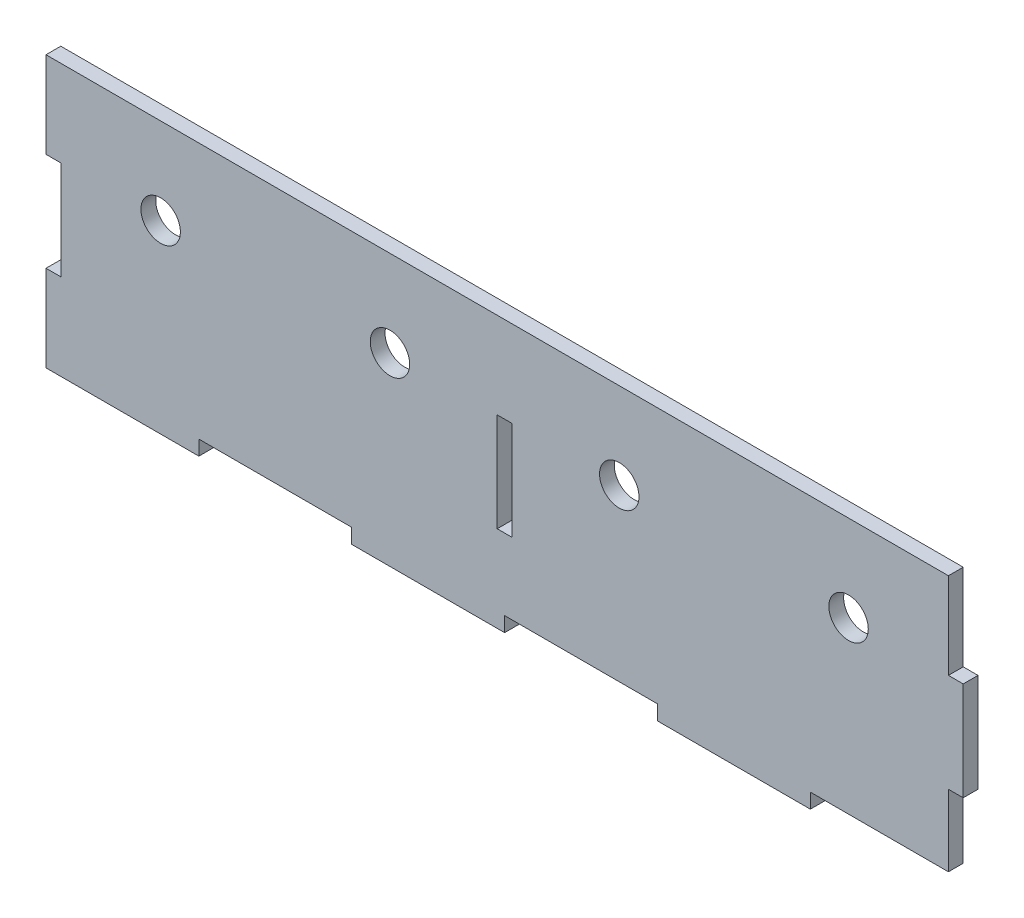
ISO-10303-21;
HEADER;
FILE_DESCRIPTION(('STEP AP214'),'2;1');
FILE_NAME('part.step','',(''),(''),'','','');
FILE_SCHEMA(('AUTOMOTIVE_DESIGN { 1 0 10303 214 1 1 1 1 }'));
ENDSEC;
DATA;
#1=APPLICATION_CONTEXT('core data for automotive mechanical design processes');
#2=APPLICATION_PROTOCOL_DEFINITION('international standard','automotive_design',2000,#1);
#3=PRODUCT_CONTEXT('',#1,'mechanical');
#4=PRODUCT('Part','Part','',(#3));
#5=PRODUCT_RELATED_PRODUCT_CATEGORY('part','',(#4));
#6=PRODUCT_DEFINITION_FORMATION('','',#4);
#7=PRODUCT_DEFINITION_CONTEXT('part definition',#1,'design');
#8=PRODUCT_DEFINITION('design','',#6,#7);
#9=PRODUCT_DEFINITION_SHAPE('','',#8);
#10=(LENGTH_UNIT() NAMED_UNIT(*) SI_UNIT(.MILLI.,.METRE.));
#11=(NAMED_UNIT(*) PLANE_ANGLE_UNIT() SI_UNIT($,.RADIAN.));
#12=(NAMED_UNIT(*) SI_UNIT($,.STERADIAN.) SOLID_ANGLE_UNIT());
#13=UNCERTAINTY_MEASURE_WITH_UNIT(LENGTH_MEASURE(1.E-05),#10,'distance_accuracy_value','');
#14=(GEOMETRIC_REPRESENTATION_CONTEXT(3) GLOBAL_UNCERTAINTY_ASSIGNED_CONTEXT((#13)) GLOBAL_UNIT_ASSIGNED_CONTEXT((#10,
#11,#12)) REPRESENTATION_CONTEXT('',''));
#15=CARTESIAN_POINT('',(0.,0.,0.));
#16=DIRECTION('',(0.,0.,1.));
#17=DIRECTION('',(1.,0.,0.));
#18=AXIS2_PLACEMENT_3D('',#15,#16,#17);
#19=CARTESIAN_POINT('',(62.,0.,3.));
#20=DIRECTION('',(-1.,0.,0.));
#21=DIRECTION('',(0.,0.,1.));
#22=AXIS2_PLACEMENT_3D('',#19,#20,#21);
#23=PLANE('',#22);
#24=DIRECTION('',(0.,1.,0.));
#25=VECTOR('',#24,1.);
#26=CARTESIAN_POINT('',(62.,0.,0.));
#27=LINE('',#26,#25);
#28=CARTESIAN_POINT('',(62.,-27.5,0.));
#29=VERTEX_POINT('',#28);
#30=CARTESIAN_POINT('',(62.,-24.4999999999999,0.));
#31=VERTEX_POINT('',#30);
#32=EDGE_CURVE('E269',#29,#31,#27,.T.);
#33=ORIENTED_EDGE('',*,*,#32,.T.);
#34=DIRECTION('',(0.,0.,-1.));
#35=VECTOR('',#34,1.);
#36=CARTESIAN_POINT('',(62.,-24.4999999999999,3.));
#37=LINE('',#36,#35);
#38=CARTESIAN_POINT('',(62.,-24.4999999999999,3.));
#39=VERTEX_POINT('',#38);
#40=EDGE_CURVE('E11',#39,#31,#37,.T.);
#41=ORIENTED_EDGE('',*,*,#40,.F.);
#42=DIRECTION('',(0.,1.,0.));
#43=VECTOR('',#42,1.);
#44=CARTESIAN_POINT('',(62.,0.,3.));
#45=LINE('',#44,#43);
#46=CARTESIAN_POINT('',(62.,-27.5,3.));
#47=VERTEX_POINT('',#46);
#48=EDGE_CURVE('E387',#47,#39,#45,.T.);
#49=ORIENTED_EDGE('',*,*,#48,.F.);
#50=DIRECTION('',(0.,0.,-1.));
#51=VECTOR('',#50,1.);
#52=CARTESIAN_POINT('',(62.,-27.5,3.));
#53=LINE('',#52,#51);
#54=EDGE_CURVE('E315',#47,#29,#53,.T.);
#55=ORIENTED_EDGE('',*,*,#54,.T.);
#56=EDGE_LOOP('',(#33,#41,#49,#55));
#57=FACE_BOUND('',#56,.T.);
#58=ADVANCED_FACE('F35',(#57),#23,.F.);
#59=CARTESIAN_POINT('',(0.,-24.4999999999999,3.));
#60=DIRECTION('',(0.,1.,0.));
#61=DIRECTION('',(0.,0.,1.));
#62=AXIS2_PLACEMENT_3D('',#59,#60,#61);
#63=PLANE('',#62);
#64=DIRECTION('',(1.,0.,0.));
#65=VECTOR('',#64,1.);
#66=CARTESIAN_POINT('',(0.,-24.4999999999999,0.));
#67=LINE('',#66,#65);
#68=CARTESIAN_POINT('',(90.,-24.4999999999999,0.));
#69=VERTEX_POINT('',#68);
#70=EDGE_CURVE('E272',#31,#69,#67,.T.);
#71=ORIENTED_EDGE('',*,*,#70,.T.);
#72=DIRECTION('',(0.,0.,-1.));
#73=VECTOR('',#72,1.);
#74=CARTESIAN_POINT('',(90.,-24.4999999999999,3.));
#75=LINE('',#74,#73);
#76=CARTESIAN_POINT('',(90.,-24.4999999999999,3.));
#77=VERTEX_POINT('',#76);
#78=EDGE_CURVE('E45',#77,#69,#75,.T.);
#79=ORIENTED_EDGE('',*,*,#78,.F.);
#80=DIRECTION('',(1.,0.,0.));
#81=VECTOR('',#80,1.);
#82=CARTESIAN_POINT('',(0.,-24.4999999999999,3.));
#83=LINE('',#82,#81);
#84=EDGE_CURVE('E395',#39,#77,#83,.T.);
#85=ORIENTED_EDGE('',*,*,#84,.F.);
#86=ORIENTED_EDGE('',*,*,#40,.T.);
#87=EDGE_LOOP('',(#71,#79,#85,#86));
#88=FACE_BOUND('',#87,.T.);
#89=ADVANCED_FACE('F471',(#88),#63,.F.);
#90=CARTESIAN_POINT('',(90.,0.,3.));
#91=DIRECTION('',(1.,0.,0.));
#92=DIRECTION('',(0.,0.,-1.));
#93=AXIS2_PLACEMENT_3D('',#90,#91,#92);
#94=PLANE('',#93);
#95=DIRECTION('',(0.,-1.,0.));
#96=VECTOR('',#95,1.);
#97=CARTESIAN_POINT('',(90.,0.,0.));
#98=LINE('',#97,#96);
#99=CARTESIAN_POINT('',(90.,-9.99999999999998,0.));
#100=VERTEX_POINT('',#99);
#101=EDGE_CURVE('E275',#100,#69,#98,.T.);
#102=ORIENTED_EDGE('',*,*,#101,.F.);
#103=DIRECTION('',(0.,0.,-1.));
#104=VECTOR('',#103,1.);
#105=CARTESIAN_POINT('',(90.,-9.99999999999998,3.));
#106=LINE('',#105,#104);
#107=CARTESIAN_POINT('',(90.,-9.99999999999998,3.));
#108=VERTEX_POINT('',#107);
#109=EDGE_CURVE('E358',#108,#100,#106,.T.);
#110=ORIENTED_EDGE('',*,*,#109,.F.);
#111=DIRECTION('',(0.,-1.,0.));
#112=VECTOR('',#111,1.);
#113=CARTESIAN_POINT('',(90.,0.,3.));
#114=LINE('',#113,#112);
#115=EDGE_CURVE('E397',#108,#77,#114,.T.);
#116=ORIENTED_EDGE('',*,*,#115,.T.);
#117=ORIENTED_EDGE('',*,*,#78,.T.);
#118=EDGE_LOOP('',(#102,#110,#116,#117));
#119=FACE_BOUND('',#118,.T.);
#120=ADVANCED_FACE('F477',(#119),#94,.T.);
#121=CARTESIAN_POINT('',(0.,-9.99999999999993,3.));
#122=DIRECTION('',(0.,-1.,0.));
#123=DIRECTION('',(1.,0.,0.));
#124=AXIS2_PLACEMENT_3D('',#121,#122,#123);
#125=PLANE('',#124);
#126=DIRECTION('',(-1.,0.,0.));
#127=VECTOR('',#126,1.);
#128=CARTESIAN_POINT('',(0.,-9.99999999999993,0.));
#129=LINE('',#128,#127);
#130=CARTESIAN_POINT('',(93.,-9.99999999999998,0.));
#131=VERTEX_POINT('',#130);
#132=EDGE_CURVE('E278',#131,#100,#129,.T.);
#133=ORIENTED_EDGE('',*,*,#132,.F.);
#134=DIRECTION('',(0.,0.,-1.));
#135=VECTOR('',#134,1.);
#136=CARTESIAN_POINT('',(93.,-9.99999999999998,3.));
#137=LINE('',#136,#135);
#138=CARTESIAN_POINT('',(93.,-9.99999999999998,3.));
#139=VERTEX_POINT('',#138);
#140=EDGE_CURVE('E356',#139,#131,#137,.T.);
#141=ORIENTED_EDGE('',*,*,#140,.F.);
#142=DIRECTION('',(-1.,0.,0.));
#143=VECTOR('',#142,1.);
#144=CARTESIAN_POINT('',(0.,-9.99999999999993,3.));
#145=LINE('',#144,#143);
#146=EDGE_CURVE('E400',#139,#108,#145,.T.);
#147=ORIENTED_EDGE('',*,*,#146,.T.);
#148=ORIENTED_EDGE('',*,*,#109,.T.);
#149=EDGE_LOOP('',(#133,#141,#147,#148));
#150=FACE_BOUND('',#149,.T.);
#151=ADVANCED_FACE('F728',(#150),#125,.T.);
#152=CARTESIAN_POINT('',(93.,0.,3.));
#153=DIRECTION('',(-1.,0.,0.));
#154=DIRECTION('',(0.,0.,1.));
#155=AXIS2_PLACEMENT_3D('',#152,#153,#154);
#156=PLANE('',#155);
#157=DIRECTION('',(0.,1.,0.));
#158=VECTOR('',#157,1.);
#159=CARTESIAN_POINT('',(93.,0.,0.));
#160=LINE('',#159,#158);
#161=CARTESIAN_POINT('',(93.,9.99999999999999,0.));
#162=VERTEX_POINT('',#161);
#163=EDGE_CURVE('E281',#131,#162,#160,.T.);
#164=ORIENTED_EDGE('',*,*,#163,.T.);
#165=DIRECTION('',(0.,0.,-1.));
#166=VECTOR('',#165,1.);
#167=CARTESIAN_POINT('',(93.,9.99999999999999,3.));
#168=LINE('',#167,#166);
#169=CARTESIAN_POINT('',(93.,9.99999999999999,3.));
#170=VERTEX_POINT('',#169);
#171=EDGE_CURVE('E353',#170,#162,#168,.T.);
#172=ORIENTED_EDGE('',*,*,#171,.F.);
#173=DIRECTION('',(0.,1.,0.));
#174=VECTOR('',#173,1.);
#175=CARTESIAN_POINT('',(93.,0.,3.));
#176=LINE('',#175,#174);
#177=EDGE_CURVE('E403',#139,#170,#176,.T.);
#178=ORIENTED_EDGE('',*,*,#177,.F.);
#179=ORIENTED_EDGE('',*,*,#140,.T.);
#180=EDGE_LOOP('',(#164,#172,#178,#179));
#181=FACE_BOUND('',#180,.T.);
#182=ADVANCED_FACE('F718',(#181),#156,.F.);
#183=CARTESIAN_POINT('',(0.,9.99999999999993,3.));
#184=DIRECTION('',(0.,-1.,0.));
#185=DIRECTION('',(1.,0.,0.));
#186=AXIS2_PLACEMENT_3D('',#183,#184,#185);
#187=PLANE('',#186);
#188=DIRECTION('',(-1.,0.,0.));
#189=VECTOR('',#188,1.);
#190=CARTESIAN_POINT('',(0.,9.99999999999993,0.));
#191=LINE('',#190,#189);
#192=CARTESIAN_POINT('',(90.,9.99999999999999,0.));
#193=VERTEX_POINT('',#192);
#194=EDGE_CURVE('E283',#162,#193,#191,.T.);
#195=ORIENTED_EDGE('',*,*,#194,.T.);
#196=DIRECTION('',(0.,0.,-1.));
#197=VECTOR('',#196,1.);
#198=CARTESIAN_POINT('',(90.,9.99999999999999,3.));
#199=LINE('',#198,#197);
#200=CARTESIAN_POINT('',(90.,9.99999999999999,3.));
#201=VERTEX_POINT('',#200);
#202=EDGE_CURVE('E350',#201,#193,#199,.T.);
#203=ORIENTED_EDGE('',*,*,#202,.F.);
#204=DIRECTION('',(-1.,0.,0.));
#205=VECTOR('',#204,1.);
#206=CARTESIAN_POINT('',(0.,9.99999999999993,3.));
#207=LINE('',#206,#205);
#208=EDGE_CURVE('E405',#170,#201,#207,.T.);
#209=ORIENTED_EDGE('',*,*,#208,.F.);
#210=ORIENTED_EDGE('',*,*,#171,.T.);
#211=EDGE_LOOP('',(#195,#203,#209,#210));
#212=FACE_BOUND('',#211,.T.);
#213=ADVANCED_FACE('F708',(#212),#187,.F.);
#214=CARTESIAN_POINT('',(90.,0.,3.));
#215=DIRECTION('',(-1.,0.,0.));
#216=DIRECTION('',(0.,0.,1.));
#217=AXIS2_PLACEMENT_3D('',#214,#215,#216);
#218=PLANE('',#217);
#219=DIRECTION('',(0.,1.,0.));
#220=VECTOR('',#219,1.);
#221=CARTESIAN_POINT('',(90.,0.,0.));
#222=LINE('',#221,#220);
#223=CARTESIAN_POINT('',(90.,27.5,0.));
#224=VERTEX_POINT('',#223);
#225=EDGE_CURVE('E285',#193,#224,#222,.T.);
#226=ORIENTED_EDGE('',*,*,#225,.T.);
#227=DIRECTION('',(0.,0.,-1.));
#228=VECTOR('',#227,1.);
#229=CARTESIAN_POINT('',(90.,27.5,3.));
#230=LINE('',#229,#228);
#231=CARTESIAN_POINT('',(90.,27.5,3.));
#232=VERTEX_POINT('',#231);
#233=EDGE_CURVE('E348',#232,#224,#230,.T.);
#234=ORIENTED_EDGE('',*,*,#233,.F.);
#235=DIRECTION('',(0.,1.,0.));
#236=VECTOR('',#235,1.);
#237=CARTESIAN_POINT('',(90.,0.,3.));
#238=LINE('',#237,#236);
#239=EDGE_CURVE('E407',#201,#232,#238,.T.);
#240=ORIENTED_EDGE('',*,*,#239,.F.);
#241=ORIENTED_EDGE('',*,*,#202,.T.);
#242=EDGE_LOOP('',(#226,#234,#240,#241));
#243=FACE_BOUND('',#242,.T.);
#244=ADVANCED_FACE('F697',(#243),#218,.F.);
#245=CARTESIAN_POINT('',(0.,27.5,3.));
#246=DIRECTION('',(0.,1.,0.));
#247=DIRECTION('',(0.,0.,1.));
#248=AXIS2_PLACEMENT_3D('',#245,#246,#247);
#249=PLANE('',#248);
#250=DIRECTION('',(1.,0.,0.));
#251=VECTOR('',#250,1.);
#252=CARTESIAN_POINT('',(0.,27.5,0.));
#253=LINE('',#252,#251);
#254=CARTESIAN_POINT('',(-93.,27.5,0.));
#255=VERTEX_POINT('',#254);
#256=EDGE_CURVE('E288',#255,#224,#253,.T.);
#257=ORIENTED_EDGE('',*,*,#256,.F.);
#258=DIRECTION('',(0.,0.,-1.));
#259=VECTOR('',#258,1.);
#260=CARTESIAN_POINT('',(-93.,27.5,3.));
#261=LINE('',#260,#259);
#262=CARTESIAN_POINT('',(-93.,27.5,3.));
#263=VERTEX_POINT('',#262);
#264=EDGE_CURVE('E346',#263,#255,#261,.T.);
#265=ORIENTED_EDGE('',*,*,#264,.F.);
#266=DIRECTION('',(1.,0.,0.));
#267=VECTOR('',#266,1.);
#268=CARTESIAN_POINT('',(0.,27.5,3.));
#269=LINE('',#268,#267);
#270=EDGE_CURVE('E409',#263,#232,#269,.T.);
#271=ORIENTED_EDGE('',*,*,#270,.T.);
#272=ORIENTED_EDGE('',*,*,#233,.T.);
#273=EDGE_LOOP('',(#257,#265,#271,#272));
#274=FACE_BOUND('',#273,.T.);
#275=ADVANCED_FACE('F687',(#274),#249,.T.);
#276=CARTESIAN_POINT('',(-93.,0.,3.));
#277=DIRECTION('',(-1.,0.,0.));
#278=DIRECTION('',(0.,0.,1.));
#279=AXIS2_PLACEMENT_3D('',#276,#277,#278);
#280=PLANE('',#279);
#281=DIRECTION('',(0.,1.,0.));
#282=VECTOR('',#281,1.);
#283=CARTESIAN_POINT('',(-93.,0.,0.));
#284=LINE('',#283,#282);
#285=CARTESIAN_POINT('',(-93.,9.99999999999999,0.));
#286=VERTEX_POINT('',#285);
#287=EDGE_CURVE('E291',#286,#255,#284,.T.);
#288=ORIENTED_EDGE('',*,*,#287,.F.);
#289=DIRECTION('',(0.,0.,-1.));
#290=VECTOR('',#289,1.);
#291=CARTESIAN_POINT('',(-93.,9.99999999999999,3.));
#292=LINE('',#291,#290);
#293=CARTESIAN_POINT('',(-93.,9.99999999999999,3.));
#294=VERTEX_POINT('',#293);
#295=EDGE_CURVE('E344',#294,#286,#292,.T.);
#296=ORIENTED_EDGE('',*,*,#295,.F.);
#297=DIRECTION('',(0.,1.,0.));
#298=VECTOR('',#297,1.);
#299=CARTESIAN_POINT('',(-93.,0.,3.));
#300=LINE('',#299,#298);
#301=EDGE_CURVE('E412',#294,#263,#300,.T.);
#302=ORIENTED_EDGE('',*,*,#301,.T.);
#303=ORIENTED_EDGE('',*,*,#264,.T.);
#304=EDGE_LOOP('',(#288,#296,#302,#303));
#305=FACE_BOUND('',#304,.T.);
#306=ADVANCED_FACE('F649',(#305),#280,.T.);
#307=CARTESIAN_POINT('',(0.,10.,3.));
#308=DIRECTION('',(0.,1.,0.));
#309=DIRECTION('',(-1.,0.,0.));
#310=AXIS2_PLACEMENT_3D('',#307,#308,#309);
#311=PLANE('',#310);
#312=DIRECTION('',(1.,0.,0.));
#313=VECTOR('',#312,1.);
#314=CARTESIAN_POINT('',(0.,10.,0.));
#315=LINE('',#314,#313);
#316=CARTESIAN_POINT('',(-90.,9.99999999999999,0.));
#317=VERTEX_POINT('',#316);
#318=EDGE_CURVE('E294',#286,#317,#315,.T.);
#319=ORIENTED_EDGE('',*,*,#318,.T.);
#320=DIRECTION('',(0.,0.,-1.));
#321=VECTOR('',#320,1.);
#322=CARTESIAN_POINT('',(-90.,9.99999999999999,3.));
#323=LINE('',#322,#321);
#324=CARTESIAN_POINT('',(-90.,9.99999999999999,3.));
#325=VERTEX_POINT('',#324);
#326=EDGE_CURVE('E341',#325,#317,#323,.T.);
#327=ORIENTED_EDGE('',*,*,#326,.F.);
#328=DIRECTION('',(1.,0.,0.));
#329=VECTOR('',#328,1.);
#330=CARTESIAN_POINT('',(0.,10.,3.));
#331=LINE('',#330,#329);
#332=EDGE_CURVE('E415',#294,#325,#331,.T.);
#333=ORIENTED_EDGE('',*,*,#332,.F.);
#334=ORIENTED_EDGE('',*,*,#295,.T.);
#335=EDGE_LOOP('',(#319,#327,#333,#334));
#336=FACE_BOUND('',#335,.T.);
#337=ADVANCED_FACE('F668',(#336),#311,.F.);
#338=CARTESIAN_POINT('',(-90.,0.,3.));
#339=DIRECTION('',(1.,0.,0.));
#340=DIRECTION('',(0.,0.,-1.));
#341=AXIS2_PLACEMENT_3D('',#338,#339,#340);
#342=PLANE('',#341);
#343=DIRECTION('',(0.,-1.,0.));
#344=VECTOR('',#343,1.);
#345=CARTESIAN_POINT('',(-90.,0.,0.));
#346=LINE('',#345,#344);
#347=CARTESIAN_POINT('',(-90.,-10.,0.));
#348=VERTEX_POINT('',#347);
#349=EDGE_CURVE('E297',#317,#348,#346,.T.);
#350=ORIENTED_EDGE('',*,*,#349,.T.);
#351=DIRECTION('',(0.,0.,-1.));
#352=VECTOR('',#351,1.);
#353=CARTESIAN_POINT('',(-90.,-10.,3.));
#354=LINE('',#353,#352);
#355=CARTESIAN_POINT('',(-90.,-10.,3.));
#356=VERTEX_POINT('',#355);
#357=EDGE_CURVE('E338',#356,#348,#354,.T.);
#358=ORIENTED_EDGE('',*,*,#357,.F.);
#359=DIRECTION('',(0.,-1.,0.));
#360=VECTOR('',#359,1.);
#361=CARTESIAN_POINT('',(-90.,0.,3.));
#362=LINE('',#361,#360);
#363=EDGE_CURVE('E418',#325,#356,#362,.T.);
#364=ORIENTED_EDGE('',*,*,#363,.F.);
#365=ORIENTED_EDGE('',*,*,#326,.T.);
#366=EDGE_LOOP('',(#350,#358,#364,#365));
#367=FACE_BOUND('',#366,.T.);
#368=ADVANCED_FACE('F658',(#367),#342,.F.);
#369=CARTESIAN_POINT('',(0.,-10.0000000000001,3.));
#370=DIRECTION('',(0.,-1.,0.));
#371=DIRECTION('',(1.,0.,0.));
#372=AXIS2_PLACEMENT_3D('',#369,#370,#371);
#373=PLANE('',#372);
#374=DIRECTION('',(-1.,0.,0.));
#375=VECTOR('',#374,1.);
#376=CARTESIAN_POINT('',(0.,-10.0000000000001,0.));
#377=LINE('',#376,#375);
#378=CARTESIAN_POINT('',(-93.,-10.,0.));
#379=VERTEX_POINT('',#378);
#380=EDGE_CURVE('E299',#348,#379,#377,.T.);
#381=ORIENTED_EDGE('',*,*,#380,.T.);
#382=DIRECTION('',(0.,0.,-1.));
#383=VECTOR('',#382,1.);
#384=CARTESIAN_POINT('',(-93.,-10.,3.));
#385=LINE('',#384,#383);
#386=CARTESIAN_POINT('',(-93.,-10.,3.));
#387=VERTEX_POINT('',#386);
#388=EDGE_CURVE('E336',#387,#379,#385,.T.);
#389=ORIENTED_EDGE('',*,*,#388,.F.);
#390=DIRECTION('',(-1.,0.,0.));
#391=VECTOR('',#390,1.);
#392=CARTESIAN_POINT('',(0.,-10.0000000000001,3.));
#393=LINE('',#392,#391);
#394=EDGE_CURVE('E420',#356,#387,#393,.T.);
#395=ORIENTED_EDGE('',*,*,#394,.F.);
#396=ORIENTED_EDGE('',*,*,#357,.T.);
#397=EDGE_LOOP('',(#381,#389,#395,#396));
#398=FACE_BOUND('',#397,.T.);
#399=ADVANCED_FACE('F646',(#398),#373,.F.);
#400=CARTESIAN_POINT('',(-93.,-27.5,0.));
#401=VERTEX_POINT('',#400);
#402=EDGE_CURVE('E295',#401,#379,#284,.T.);
#403=ORIENTED_EDGE('',*,*,#402,.F.);
#404=DIRECTION('',(0.,0.,-1.));
#405=VECTOR('',#404,1.);
#406=CARTESIAN_POINT('',(-93.,-27.5,3.));
#407=LINE('',#406,#405);
#408=CARTESIAN_POINT('',(-93.,-27.5,3.));
#409=VERTEX_POINT('',#408);
#410=EDGE_CURVE('E334',#409,#401,#407,.T.);
#411=ORIENTED_EDGE('',*,*,#410,.F.);
#412=EDGE_CURVE('E416',#409,#387,#300,.T.);
#413=ORIENTED_EDGE('',*,*,#412,.T.);
#414=ORIENTED_EDGE('',*,*,#388,.T.);
#415=EDGE_LOOP('',(#403,#411,#413,#414));
#416=FACE_BOUND('',#415,.T.);
#417=ADVANCED_FACE('F636',(#416),#280,.T.);
#418=CARTESIAN_POINT('',(0.,-27.5,3.));
#419=DIRECTION('',(0.,1.,0.));
#420=DIRECTION('',(0.,0.,1.));
#421=AXIS2_PLACEMENT_3D('',#418,#419,#420);
#422=PLANE('',#421);
#423=DIRECTION('',(1.,0.,0.));
#424=VECTOR('',#423,1.);
#425=CARTESIAN_POINT('',(0.,-27.5,0.));
#426=LINE('',#425,#424);
#427=CARTESIAN_POINT('',(-62.,-27.5,0.));
#428=VERTEX_POINT('',#427);
#429=EDGE_CURVE('E302',#401,#428,#426,.T.);
#430=ORIENTED_EDGE('',*,*,#429,.T.);
#431=DIRECTION('',(0.,0.,-1.));
#432=VECTOR('',#431,1.);
#433=CARTESIAN_POINT('',(-62.,-27.5,3.));
#434=LINE('',#433,#432);
#435=CARTESIAN_POINT('',(-62.,-27.5,3.));
#436=VERTEX_POINT('',#435);
#437=EDGE_CURVE('E331',#436,#428,#434,.T.);
#438=ORIENTED_EDGE('',*,*,#437,.F.);
#439=DIRECTION('',(1.,0.,0.));
#440=VECTOR('',#439,1.);
#441=CARTESIAN_POINT('',(0.,-27.5,3.));
#442=LINE('',#441,#440);
#443=EDGE_CURVE('E242',#409,#436,#442,.T.);
#444=ORIENTED_EDGE('',*,*,#443,.F.);
#445=ORIENTED_EDGE('',*,*,#410,.T.);
#446=EDGE_LOOP('',(#430,#438,#444,#445));
#447=FACE_BOUND('',#446,.T.);
#448=ADVANCED_FACE('F468',(#447),#422,.F.);
#449=CARTESIAN_POINT('',(-62.,0.,3.));
#450=DIRECTION('',(-1.,0.,0.));
#451=DIRECTION('',(0.,0.,1.));
#452=AXIS2_PLACEMENT_3D('',#449,#450,#451);
#453=PLANE('',#452);
#454=DIRECTION('',(0.,1.,0.));
#455=VECTOR('',#454,1.);
#456=CARTESIAN_POINT('',(-62.,0.,0.));
#457=LINE('',#456,#455);
#458=CARTESIAN_POINT('',(-62.,-24.5,0.));
#459=VERTEX_POINT('',#458);
#460=EDGE_CURVE('E304',#428,#459,#457,.T.);
#461=ORIENTED_EDGE('',*,*,#460,.T.);
#462=DIRECTION('',(0.,0.,-1.));
#463=VECTOR('',#462,1.);
#464=CARTESIAN_POINT('',(-62.,-24.5,3.));
#465=LINE('',#464,#463);
#466=CARTESIAN_POINT('',(-62.,-24.5,3.));
#467=VERTEX_POINT('',#466);
#468=EDGE_CURVE('E328',#467,#459,#465,.T.);
#469=ORIENTED_EDGE('',*,*,#468,.F.);
#470=DIRECTION('',(0.,1.,0.));
#471=VECTOR('',#470,1.);
#472=CARTESIAN_POINT('',(-62.,0.,3.));
#473=LINE('',#472,#471);
#474=EDGE_CURVE('E422',#436,#467,#473,.T.);
#475=ORIENTED_EDGE('',*,*,#474,.F.);
#476=ORIENTED_EDGE('',*,*,#437,.T.);
#477=EDGE_LOOP('',(#461,#469,#475,#476));
#478=FACE_BOUND('',#477,.T.);
#479=ADVANCED_FACE('F617',(#478),#453,.F.);
#480=CARTESIAN_POINT('',(0.,-24.5,3.));
#481=DIRECTION('',(0.,1.,0.));
#482=DIRECTION('',(0.,0.,1.));
#483=AXIS2_PLACEMENT_3D('',#480,#481,#482);
#484=PLANE('',#483);
#485=DIRECTION('',(1.,0.,0.));
#486=VECTOR('',#485,1.);
#487=CARTESIAN_POINT('',(0.,-24.5,0.));
#488=LINE('',#487,#486);
#489=CARTESIAN_POINT('',(-31.,-24.5,0.));
#490=VERTEX_POINT('',#489);
#491=EDGE_CURVE('E307',#459,#490,#488,.T.);
#492=ORIENTED_EDGE('',*,*,#491,.T.);
#493=DIRECTION('',(0.,0.,-1.));
#494=VECTOR('',#493,1.);
#495=CARTESIAN_POINT('',(-31.,-24.5,3.));
#496=LINE('',#495,#494);
#497=CARTESIAN_POINT('',(-31.,-24.5,3.));
#498=VERTEX_POINT('',#497);
#499=EDGE_CURVE('E325',#498,#490,#496,.T.);
#500=ORIENTED_EDGE('',*,*,#499,.F.);
#501=DIRECTION('',(1.,0.,0.));
#502=VECTOR('',#501,1.);
#503=CARTESIAN_POINT('',(0.,-24.5,3.));
#504=LINE('',#503,#502);
#505=EDGE_CURVE('E424',#467,#498,#504,.T.);
#506=ORIENTED_EDGE('',*,*,#505,.F.);
#507=ORIENTED_EDGE('',*,*,#468,.T.);
#508=EDGE_LOOP('',(#492,#500,#506,#507));
#509=FACE_BOUND('',#508,.T.);
#510=ADVANCED_FACE('F607',(#509),#484,.F.);
#511=CARTESIAN_POINT('',(-31.,0.,3.));
#512=DIRECTION('',(1.,0.,0.));
#513=DIRECTION('',(0.,0.,-1.));
#514=AXIS2_PLACEMENT_3D('',#511,#512,#513);
#515=PLANE('',#514);
#516=DIRECTION('',(0.,-1.,0.));
#517=VECTOR('',#516,1.);
#518=CARTESIAN_POINT('',(-31.,0.,0.));
#519=LINE('',#518,#517);
#520=CARTESIAN_POINT('',(-31.,-27.5,0.));
#521=VERTEX_POINT('',#520);
#522=EDGE_CURVE('E309',#490,#521,#519,.T.);
#523=ORIENTED_EDGE('',*,*,#522,.T.);
#524=DIRECTION('',(0.,0.,-1.));
#525=VECTOR('',#524,1.);
#526=CARTESIAN_POINT('',(-31.,-27.5,3.));
#527=LINE('',#526,#525);
#528=CARTESIAN_POINT('',(-31.,-27.5,3.));
#529=VERTEX_POINT('',#528);
#530=EDGE_CURVE('E322',#529,#521,#527,.T.);
#531=ORIENTED_EDGE('',*,*,#530,.F.);
#532=DIRECTION('',(0.,-1.,0.));
#533=VECTOR('',#532,1.);
#534=CARTESIAN_POINT('',(-31.,0.,3.));
#535=LINE('',#534,#533);
#536=EDGE_CURVE('E426',#498,#529,#535,.T.);
#537=ORIENTED_EDGE('',*,*,#536,.F.);
#538=ORIENTED_EDGE('',*,*,#499,.T.);
#539=EDGE_LOOP('',(#523,#531,#537,#538));
#540=FACE_BOUND('',#539,.T.);
#541=ADVANCED_FACE('F597',(#540),#515,.F.);
#542=CARTESIAN_POINT('',(0.,-27.5,0.));
#543=VERTEX_POINT('',#542);
#544=EDGE_CURVE('E305',#521,#543,#426,.T.);
#545=ORIENTED_EDGE('',*,*,#544,.T.);
#546=DIRECTION('',(0.,0.,-1.));
#547=VECTOR('',#546,1.);
#548=CARTESIAN_POINT('',(0.,-27.5,3.));
#549=LINE('',#548,#547);
#550=CARTESIAN_POINT('',(0.,-27.5,3.));
#551=VERTEX_POINT('',#550);
#552=EDGE_CURVE('E319',#551,#543,#549,.T.);
#553=ORIENTED_EDGE('',*,*,#552,.F.);
#554=EDGE_CURVE('E241',#529,#551,#442,.T.);
#555=ORIENTED_EDGE('',*,*,#554,.F.);
#556=ORIENTED_EDGE('',*,*,#530,.T.);
#557=EDGE_LOOP('',(#545,#553,#555,#556));
#558=FACE_BOUND('',#557,.T.);
#559=ADVANCED_FACE('F432',(#558),#422,.F.);
#560=CARTESIAN_POINT('',(0.,0.,3.));
#561=DIRECTION('',(-1.,0.,0.));
#562=DIRECTION('',(0.,0.,1.));
#563=AXIS2_PLACEMENT_3D('',#560,#561,#562);
#564=PLANE('',#563);
#565=DIRECTION('',(0.,1.,0.));
#566=VECTOR('',#565,1.);
#567=CARTESIAN_POINT('',(0.,0.,0.));
#568=LINE('',#567,#566);
#569=CARTESIAN_POINT('',(0.,-24.5,0.));
#570=VERTEX_POINT('',#569);
#571=EDGE_CURVE('E311',#543,#570,#568,.T.);
#572=ORIENTED_EDGE('',*,*,#571,.T.);
#573=DIRECTION('',(0.,0.,-1.));
#574=VECTOR('',#573,1.);
#575=CARTESIAN_POINT('',(0.,-24.5,3.));
#576=LINE('',#575,#574);
#577=CARTESIAN_POINT('',(0.,-24.5,3.));
#578=VERTEX_POINT('',#577);
#579=EDGE_CURVE('E234',#578,#570,#576,.T.);
#580=ORIENTED_EDGE('',*,*,#579,.F.);
#581=DIRECTION('',(0.,1.,0.));
#582=VECTOR('',#581,1.);
#583=CARTESIAN_POINT('',(0.,0.,3.));
#584=LINE('',#583,#582);
#585=EDGE_CURVE('E225',#551,#578,#584,.T.);
#586=ORIENTED_EDGE('',*,*,#585,.F.);
#587=ORIENTED_EDGE('',*,*,#552,.T.);
#588=EDGE_LOOP('',(#572,#580,#586,#587));
#589=FACE_BOUND('',#588,.T.);
#590=ADVANCED_FACE('F436',(#589),#564,.F.);
#591=CARTESIAN_POINT('',(0.,-24.5,3.));
#592=DIRECTION('',(0.,1.,0.));
#593=DIRECTION('',(0.,0.,1.));
#594=AXIS2_PLACEMENT_3D('',#591,#592,#593);
#595=PLANE('',#594);
#596=DIRECTION('',(1.,0.,0.));
#597=VECTOR('',#596,1.);
#598=CARTESIAN_POINT('',(0.,-24.5,0.));
#599=LINE('',#598,#597);
#600=CARTESIAN_POINT('',(31.,-24.5,0.));
#601=VERTEX_POINT('',#600);
#602=EDGE_CURVE('E233',#570,#601,#599,.T.);
#603=ORIENTED_EDGE('',*,*,#602,.T.);
#604=DIRECTION('',(0.,0.,-1.));
#605=VECTOR('',#604,1.);
#606=CARTESIAN_POINT('',(31.,-24.5,3.));
#607=LINE('',#606,#605);
#608=CARTESIAN_POINT('',(31.,-24.5,3.));
#609=VERTEX_POINT('',#608);
#610=EDGE_CURVE('E230',#609,#601,#607,.T.);
#611=ORIENTED_EDGE('',*,*,#610,.F.);
#612=DIRECTION('',(1.,0.,0.));
#613=VECTOR('',#612,1.);
#614=CARTESIAN_POINT('',(0.,-24.5,3.));
#615=LINE('',#614,#613);
#616=EDGE_CURVE('E219',#578,#609,#615,.T.);
#617=ORIENTED_EDGE('',*,*,#616,.F.);
#618=ORIENTED_EDGE('',*,*,#579,.T.);
#619=EDGE_LOOP('',(#603,#611,#617,#618));
#620=FACE_BOUND('',#619,.T.);
#621=ADVANCED_FACE('F231',(#620),#595,.F.);
#622=CARTESIAN_POINT('',(31.,0.,3.));
#623=DIRECTION('',(1.,0.,0.));
#624=DIRECTION('',(0.,0.,-1.));
#625=AXIS2_PLACEMENT_3D('',#622,#623,#624);
#626=PLANE('',#625);
#627=DIRECTION('',(0.,-1.,0.));
#628=VECTOR('',#627,1.);
#629=CARTESIAN_POINT('',(31.,0.,0.));
#630=LINE('',#629,#628);
#631=CARTESIAN_POINT('',(31.,-27.5,0.));
#632=VERTEX_POINT('',#631);
#633=EDGE_CURVE('E137',#601,#632,#630,.T.);
#634=ORIENTED_EDGE('',*,*,#633,.T.);
#635=DIRECTION('',(0.,0.,-1.));
#636=VECTOR('',#635,1.);
#637=CARTESIAN_POINT('',(31.,-27.5,3.));
#638=LINE('',#637,#636);
#639=CARTESIAN_POINT('',(31.,-27.5,3.));
#640=VERTEX_POINT('',#639);
#641=EDGE_CURVE('E235',#640,#632,#638,.T.);
#642=ORIENTED_EDGE('',*,*,#641,.F.);
#643=DIRECTION('',(0.,-1.,0.));
#644=VECTOR('',#643,1.);
#645=CARTESIAN_POINT('',(31.,0.,3.));
#646=LINE('',#645,#644);
#647=EDGE_CURVE('E223',#609,#640,#646,.T.);
#648=ORIENTED_EDGE('',*,*,#647,.F.);
#649=ORIENTED_EDGE('',*,*,#610,.T.);
#650=EDGE_LOOP('',(#634,#642,#648,#649));
#651=FACE_BOUND('',#650,.T.);
#652=ADVANCED_FACE('F237',(#651),#626,.F.);
#653=CARTESIAN_POINT('',(1.50000000000003,0.,3.));
#654=DIRECTION('',(-1.,0.,0.));
#655=DIRECTION('',(0.,0.,1.));
#656=AXIS2_PLACEMENT_3D('',#653,#654,#655);
#657=PLANE('',#656);
#658=DIRECTION('',(0.,1.,0.));
#659=VECTOR('',#658,1.);
#660=CARTESIAN_POINT('',(1.50000000000003,0.,0.));
#661=LINE('',#660,#659);
#662=CARTESIAN_POINT('',(1.50000000000003,-10.,0.));
#663=VERTEX_POINT('',#662);
#664=CARTESIAN_POINT('',(1.50000000000003,10.,0.));
#665=VERTEX_POINT('',#664);
#666=EDGE_CURVE('E257',#663,#665,#661,.T.);
#667=ORIENTED_EDGE('',*,*,#666,.F.);
#668=DIRECTION('',(0.,0.,-1.));
#669=VECTOR('',#668,1.);
#670=CARTESIAN_POINT('',(1.50000000000003,-10.,3.));
#671=LINE('',#670,#669);
#672=CARTESIAN_POINT('',(1.50000000000003,-10.,3.));
#673=VERTEX_POINT('',#672);
#674=EDGE_CURVE('E39',#673,#663,#671,.T.);
#675=ORIENTED_EDGE('',*,*,#674,.F.);
#676=DIRECTION('',(0.,1.,0.));
#677=VECTOR('',#676,1.);
#678=CARTESIAN_POINT('',(1.50000000000003,0.,3.));
#679=LINE('',#678,#677);
#680=CARTESIAN_POINT('',(1.50000000000003,10.,3.));
#681=VERTEX_POINT('',#680);
#682=EDGE_CURVE('E390',#673,#681,#679,.T.);
#683=ORIENTED_EDGE('',*,*,#682,.T.);
#684=DIRECTION('',(0.,0.,-1.));
#685=VECTOR('',#684,1.);
#686=CARTESIAN_POINT('',(1.50000000000003,10.,3.));
#687=LINE('',#686,#685);
#688=EDGE_CURVE('E239',#681,#665,#687,.T.);
#689=ORIENTED_EDGE('',*,*,#688,.T.);
#690=EDGE_LOOP('',(#667,#675,#683,#689));
#691=FACE_BOUND('',#690,.T.);
#692=ADVANCED_FACE('F374',(#691),#657,.T.);
#693=CARTESIAN_POINT('',(0.,-10.,3.));
#694=DIRECTION('',(0.,1.,0.));
#695=DIRECTION('',(0.,0.,1.));
#696=AXIS2_PLACEMENT_3D('',#693,#694,#695);
#697=PLANE('',#696);
#698=DIRECTION('',(1.,0.,0.));
#699=VECTOR('',#698,1.);
#700=CARTESIAN_POINT('',(0.,-10.,0.));
#701=LINE('',#700,#699);
#702=CARTESIAN_POINT('',(-1.49999999999997,-10.,0.));
#703=VERTEX_POINT('',#702);
#704=EDGE_CURVE('E260',#703,#663,#701,.T.);
#705=ORIENTED_EDGE('',*,*,#704,.F.);
#706=DIRECTION('',(0.,0.,-1.));
#707=VECTOR('',#706,1.);
#708=CARTESIAN_POINT('',(-1.49999999999997,-10.,3.));
#709=LINE('',#708,#707);
#710=CARTESIAN_POINT('',(-1.49999999999997,-10.,3.));
#711=VERTEX_POINT('',#710);
#712=EDGE_CURVE('E364',#711,#703,#709,.T.);
#713=ORIENTED_EDGE('',*,*,#712,.F.);
#714=DIRECTION('',(1.,0.,0.));
#715=VECTOR('',#714,1.);
#716=CARTESIAN_POINT('',(0.,-10.,3.));
#717=LINE('',#716,#715);
#718=EDGE_CURVE('E373',#711,#673,#717,.T.);
#719=ORIENTED_EDGE('',*,*,#718,.T.);
#720=ORIENTED_EDGE('',*,*,#674,.T.);
#721=EDGE_LOOP('',(#705,#713,#719,#720));
#722=FACE_BOUND('',#721,.T.);
#723=ADVANCED_FACE('F371',(#722),#697,.T.);
#724=CARTESIAN_POINT('',(-1.49999999999997,0.,3.));
#725=DIRECTION('',(-1.,0.,0.));
#726=DIRECTION('',(0.,0.,1.));
#727=AXIS2_PLACEMENT_3D('',#724,#725,#726);
#728=PLANE('',#727);
#729=DIRECTION('',(0.,1.,0.));
#730=VECTOR('',#729,1.);
#731=CARTESIAN_POINT('',(-1.49999999999997,0.,0.));
#732=LINE('',#731,#730);
#733=CARTESIAN_POINT('',(-1.49999999999997,10.,0.));
#734=VERTEX_POINT('',#733);
#735=EDGE_CURVE('E263',#703,#734,#732,.T.);
#736=ORIENTED_EDGE('',*,*,#735,.T.);
#737=DIRECTION('',(0.,0.,-1.));
#738=VECTOR('',#737,1.);
#739=CARTESIAN_POINT('',(-1.49999999999997,10.,3.));
#740=LINE('',#739,#738);
#741=CARTESIAN_POINT('',(-1.49999999999997,10.,3.));
#742=VERTEX_POINT('',#741);
#743=EDGE_CURVE('E362',#742,#734,#740,.T.);
#744=ORIENTED_EDGE('',*,*,#743,.F.);
#745=DIRECTION('',(0.,1.,0.));
#746=VECTOR('',#745,1.);
#747=CARTESIAN_POINT('',(-1.49999999999997,0.,3.));
#748=LINE('',#747,#746);
#749=EDGE_CURVE('E382',#711,#742,#748,.T.);
#750=ORIENTED_EDGE('',*,*,#749,.F.);
#751=ORIENTED_EDGE('',*,*,#712,.T.);
#752=EDGE_LOOP('',(#736,#744,#750,#751));
#753=FACE_BOUND('',#752,.T.);
#754=ADVANCED_FACE('F380',(#753),#728,.F.);
#755=CARTESIAN_POINT('',(0.,10.,3.));
#756=DIRECTION('',(0.,1.,0.));
#757=DIRECTION('',(0.,0.,1.));
#758=AXIS2_PLACEMENT_3D('',#755,#756,#757);
#759=PLANE('',#758);
#760=DIRECTION('',(1.,0.,0.));
#761=VECTOR('',#760,1.);
#762=CARTESIAN_POINT('',(0.,10.,0.));
#763=LINE('',#762,#761);
#764=EDGE_CURVE('E266',#734,#665,#763,.T.);
#765=ORIENTED_EDGE('',*,*,#764,.T.);
#766=ORIENTED_EDGE('',*,*,#688,.F.);
#767=DIRECTION('',(1.,0.,0.));
#768=VECTOR('',#767,1.);
#769=CARTESIAN_POINT('',(0.,10.,3.));
#770=LINE('',#769,#768);
#771=EDGE_CURVE('E385',#742,#681,#770,.T.);
#772=ORIENTED_EDGE('',*,*,#771,.F.);
#773=ORIENTED_EDGE('',*,*,#743,.T.);
#774=EDGE_LOOP('',(#765,#766,#772,#773));
#775=FACE_BOUND('',#774,.T.);
#776=ADVANCED_FACE('F384',(#775),#759,.F.);
#777=CARTESIAN_POINT('',(-69.75,9.99999999999999,3.));
#778=DIRECTION('',(0.,0.,-1.));
#779=DIRECTION('',(-1.,0.,0.));
#780=AXIS2_PLACEMENT_3D('',#777,#778,#779);
#781=CYLINDRICAL_SURFACE('',#780,4.00000000000001);
#782=CARTESIAN_POINT('',(-69.75,9.99999999999999,3.));
#783=DIRECTION('',(0.,0.,1.));
#784=DIRECTION('',(1.,0.,0.));
#785=AXIS2_PLACEMENT_3D('',#782,#783,#784);
#786=CIRCLE('',#785,4.00000000000001);
#787=CARTESIAN_POINT('',(-65.7499999999999,9.99999999999999,3.));
#788=VERTEX_POINT('',#787);
#789=EDGE_CURVE('E450',#788,#788,#786,.T.);
#790=ORIENTED_EDGE('',*,*,#789,.T.);
#791=EDGE_LOOP('',(#790));
#792=FACE_BOUND('',#791,.T.);
#793=CARTESIAN_POINT('',(-69.75,9.99999999999999,0.));
#794=DIRECTION('',(0.,0.,1.));
#795=DIRECTION('',(1.,0.,0.));
#796=AXIS2_PLACEMENT_3D('',#793,#794,#795);
#797=CIRCLE('',#796,4.00000000000001);
#798=CARTESIAN_POINT('',(-65.7499999999999,9.99999999999999,0.));
#799=VERTEX_POINT('',#798);
#800=EDGE_CURVE('E254',#799,#799,#797,.T.);
#801=ORIENTED_EDGE('',*,*,#800,.F.);
#802=EDGE_LOOP('',(#801));
#803=FACE_BOUND('',#802,.T.);
#804=ADVANCED_FACE('F454',(#792,#803),#781,.F.);
#805=CARTESIAN_POINT('',(-23.25,9.99999999999999,3.));
#806=DIRECTION('',(0.,0.,-1.));
#807=DIRECTION('',(-1.,0.,0.));
#808=AXIS2_PLACEMENT_3D('',#805,#806,#807);
#809=CYLINDRICAL_SURFACE('',#808,4.);
#810=CARTESIAN_POINT('',(-23.25,9.99999999999999,3.));
#811=DIRECTION('',(0.,0.,1.));
#812=DIRECTION('',(1.,0.,0.));
#813=AXIS2_PLACEMENT_3D('',#810,#811,#812);
#814=CIRCLE('',#813,4.);
#815=CARTESIAN_POINT('',(-19.25,9.99999999999999,3.));
#816=VERTEX_POINT('',#815);
#817=EDGE_CURVE('E445',#816,#816,#814,.T.);
#818=ORIENTED_EDGE('',*,*,#817,.T.);
#819=EDGE_LOOP('',(#818));
#820=FACE_BOUND('',#819,.T.);
#821=CARTESIAN_POINT('',(-23.25,9.99999999999999,0.));
#822=DIRECTION('',(0.,0.,1.));
#823=DIRECTION('',(1.,0.,0.));
#824=AXIS2_PLACEMENT_3D('',#821,#822,#823);
#825=CIRCLE('',#824,4.);
#826=CARTESIAN_POINT('',(-19.25,9.99999999999999,0.));
#827=VERTEX_POINT('',#826);
#828=EDGE_CURVE('E251',#827,#827,#825,.T.);
#829=ORIENTED_EDGE('',*,*,#828,.F.);
#830=EDGE_LOOP('',(#829));
#831=FACE_BOUND('',#830,.T.);
#832=ADVANCED_FACE('F492',(#820,#831),#809,.F.);
#833=CARTESIAN_POINT('',(23.25,9.99999999999999,3.));
#834=DIRECTION('',(0.,0.,-1.));
#835=DIRECTION('',(-1.,0.,0.));
#836=AXIS2_PLACEMENT_3D('',#833,#834,#835);
#837=CYLINDRICAL_SURFACE('',#836,4.);
#838=CARTESIAN_POINT('',(23.25,9.99999999999999,3.));
#839=DIRECTION('',(0.,0.,1.));
#840=DIRECTION('',(1.,0.,0.));
#841=AXIS2_PLACEMENT_3D('',#838,#839,#840);
#842=CIRCLE('',#841,4.);
#843=CARTESIAN_POINT('',(27.25,9.99999999999999,3.));
#844=VERTEX_POINT('',#843);
#845=EDGE_CURVE('E440',#844,#844,#842,.T.);
#846=ORIENTED_EDGE('',*,*,#845,.T.);
#847=EDGE_LOOP('',(#846));
#848=FACE_BOUND('',#847,.T.);
#849=CARTESIAN_POINT('',(23.25,9.99999999999999,0.));
#850=DIRECTION('',(0.,0.,1.));
#851=DIRECTION('',(1.,0.,0.));
#852=AXIS2_PLACEMENT_3D('',#849,#850,#851);
#853=CIRCLE('',#852,4.);
#854=CARTESIAN_POINT('',(27.25,9.99999999999999,0.));
#855=VERTEX_POINT('',#854);
#856=EDGE_CURVE('E248',#855,#855,#853,.T.);
#857=ORIENTED_EDGE('',*,*,#856,.F.);
#858=EDGE_LOOP('',(#857));
#859=FACE_BOUND('',#858,.T.);
#860=ADVANCED_FACE('F494',(#848,#859),#837,.F.);
#861=CARTESIAN_POINT('',(69.75,9.99999999999999,3.));
#862=DIRECTION('',(0.,0.,-1.));
#863=DIRECTION('',(-1.,0.,0.));
#864=AXIS2_PLACEMENT_3D('',#861,#862,#863);
#865=CYLINDRICAL_SURFACE('',#864,4.00000000000001);
#866=CARTESIAN_POINT('',(69.75,9.99999999999999,3.));
#867=DIRECTION('',(0.,0.,1.));
#868=DIRECTION('',(1.,0.,0.));
#869=AXIS2_PLACEMENT_3D('',#866,#867,#868);
#870=CIRCLE('',#869,4.00000000000001);
#871=CARTESIAN_POINT('',(73.7500000000001,9.99999999999999,3.));
#872=VERTEX_POINT('',#871);
#873=EDGE_CURVE('E438',#872,#872,#870,.T.);
#874=ORIENTED_EDGE('',*,*,#873,.T.);
#875=EDGE_LOOP('',(#874));
#876=FACE_BOUND('',#875,.T.);
#877=CARTESIAN_POINT('',(69.75,9.99999999999999,0.));
#878=DIRECTION('',(0.,0.,1.));
#879=DIRECTION('',(1.,0.,0.));
#880=AXIS2_PLACEMENT_3D('',#877,#878,#879);
#881=CIRCLE('',#880,4.00000000000001);
#882=CARTESIAN_POINT('',(73.7500000000001,9.99999999999999,0.));
#883=VERTEX_POINT('',#882);
#884=EDGE_CURVE('E245',#883,#883,#881,.T.);
#885=ORIENTED_EDGE('',*,*,#884,.F.);
#886=EDGE_LOOP('',(#885));
#887=FACE_BOUND('',#886,.T.);
#888=ADVANCED_FACE('F37',(#876,#887),#865,.F.);
#889=EDGE_CURVE('E143',#632,#29,#426,.T.);
#890=ORIENTED_EDGE('',*,*,#889,.T.);
#891=ORIENTED_EDGE('',*,*,#54,.F.);
#892=EDGE_CURVE('E54',#640,#47,#442,.T.);
#893=ORIENTED_EDGE('',*,*,#892,.F.);
#894=ORIENTED_EDGE('',*,*,#641,.T.);
#895=EDGE_LOOP('',(#890,#891,#893,#894));
#896=FACE_BOUND('',#895,.T.);
#897=ADVANCED_FACE('F458',(#896),#422,.F.);
#898=CARTESIAN_POINT('',(0.,0.,3.));
#899=DIRECTION('',(0.,0.,1.));
#900=DIRECTION('',(1.,0.,0.));
#901=AXIS2_PLACEMENT_3D('',#898,#899,#900);
#902=PLANE('',#901);
#903=ORIENTED_EDGE('',*,*,#873,.F.);
#904=EDGE_LOOP('',(#903));
#905=FACE_BOUND('',#904,.T.);
#906=ORIENTED_EDGE('',*,*,#845,.F.);
#907=EDGE_LOOP('',(#906));
#908=FACE_BOUND('',#907,.T.);
#909=ORIENTED_EDGE('',*,*,#817,.F.);
#910=EDGE_LOOP('',(#909));
#911=FACE_BOUND('',#910,.T.);
#912=ORIENTED_EDGE('',*,*,#789,.F.);
#913=EDGE_LOOP('',(#912));
#914=FACE_BOUND('',#913,.T.);
#915=ORIENTED_EDGE('',*,*,#682,.F.);
#916=ORIENTED_EDGE('',*,*,#718,.F.);
#917=ORIENTED_EDGE('',*,*,#749,.T.);
#918=ORIENTED_EDGE('',*,*,#771,.T.);
#919=EDGE_LOOP('',(#915,#916,#917,#918));
#920=FACE_BOUND('',#919,.T.);
#921=ORIENTED_EDGE('',*,*,#48,.T.);
#922=ORIENTED_EDGE('',*,*,#84,.T.);
#923=ORIENTED_EDGE('',*,*,#115,.F.);
#924=ORIENTED_EDGE('',*,*,#146,.F.);
#925=ORIENTED_EDGE('',*,*,#177,.T.);
#926=ORIENTED_EDGE('',*,*,#208,.T.);
#927=ORIENTED_EDGE('',*,*,#239,.T.);
#928=ORIENTED_EDGE('',*,*,#270,.F.);
#929=ORIENTED_EDGE('',*,*,#301,.F.);
#930=ORIENTED_EDGE('',*,*,#332,.T.);
#931=ORIENTED_EDGE('',*,*,#363,.T.);
#932=ORIENTED_EDGE('',*,*,#394,.T.);
#933=ORIENTED_EDGE('',*,*,#412,.F.);
#934=ORIENTED_EDGE('',*,*,#443,.T.);
#935=ORIENTED_EDGE('',*,*,#474,.T.);
#936=ORIENTED_EDGE('',*,*,#505,.T.);
#937=ORIENTED_EDGE('',*,*,#536,.T.);
#938=ORIENTED_EDGE('',*,*,#554,.T.);
#939=ORIENTED_EDGE('',*,*,#585,.T.);
#940=ORIENTED_EDGE('',*,*,#616,.T.);
#941=ORIENTED_EDGE('',*,*,#647,.T.);
#942=ORIENTED_EDGE('',*,*,#892,.T.);
#943=EDGE_LOOP('',(#921,#922,#923,#924,#925,#926,#927,#928,#929,#930,#931,#932,#933,#934,#935,
#936,#937,#938,#939,#940,#941,#942));
#944=FACE_BOUND('',#943,.T.);
#945=ADVANCED_FACE('F221',(#905,#908,#911,#914,#920,#944),#902,.T.);
#946=CARTESIAN_POINT('',(0.,0.,0.));
#947=DIRECTION('',(0.,0.,1.));
#948=DIRECTION('',(1.,0.,0.));
#949=AXIS2_PLACEMENT_3D('',#946,#947,#948);
#950=PLANE('',#949);
#951=ORIENTED_EDGE('',*,*,#884,.T.);
#952=EDGE_LOOP('',(#951));
#953=FACE_BOUND('',#952,.T.);
#954=ORIENTED_EDGE('',*,*,#856,.T.);
#955=EDGE_LOOP('',(#954));
#956=FACE_BOUND('',#955,.T.);
#957=ORIENTED_EDGE('',*,*,#828,.T.);
#958=EDGE_LOOP('',(#957));
#959=FACE_BOUND('',#958,.T.);
#960=ORIENTED_EDGE('',*,*,#800,.T.);
#961=EDGE_LOOP('',(#960));
#962=FACE_BOUND('',#961,.T.);
#963=ORIENTED_EDGE('',*,*,#666,.T.);
#964=ORIENTED_EDGE('',*,*,#764,.F.);
#965=ORIENTED_EDGE('',*,*,#735,.F.);
#966=ORIENTED_EDGE('',*,*,#704,.T.);
#967=EDGE_LOOP('',(#963,#964,#965,#966));
#968=FACE_BOUND('',#967,.T.);
#969=ORIENTED_EDGE('',*,*,#32,.F.);
#970=ORIENTED_EDGE('',*,*,#889,.F.);
#971=ORIENTED_EDGE('',*,*,#633,.F.);
#972=ORIENTED_EDGE('',*,*,#602,.F.);
#973=ORIENTED_EDGE('',*,*,#571,.F.);
#974=ORIENTED_EDGE('',*,*,#544,.F.);
#975=ORIENTED_EDGE('',*,*,#522,.F.);
#976=ORIENTED_EDGE('',*,*,#491,.F.);
#977=ORIENTED_EDGE('',*,*,#460,.F.);
#978=ORIENTED_EDGE('',*,*,#429,.F.);
#979=ORIENTED_EDGE('',*,*,#402,.T.);
#980=ORIENTED_EDGE('',*,*,#380,.F.);
#981=ORIENTED_EDGE('',*,*,#349,.F.);
#982=ORIENTED_EDGE('',*,*,#318,.F.);
#983=ORIENTED_EDGE('',*,*,#287,.T.);
#984=ORIENTED_EDGE('',*,*,#256,.T.);
#985=ORIENTED_EDGE('',*,*,#225,.F.);
#986=ORIENTED_EDGE('',*,*,#194,.F.);
#987=ORIENTED_EDGE('',*,*,#163,.F.);
#988=ORIENTED_EDGE('',*,*,#132,.T.);
#989=ORIENTED_EDGE('',*,*,#101,.T.);
#990=ORIENTED_EDGE('',*,*,#70,.F.);
#991=EDGE_LOOP('',(#969,#970,#971,#972,#973,#974,#975,#976,#977,#978,#979,#980,#981,#982,#983,
#984,#985,#986,#987,#988,#989,#990));
#992=FACE_BOUND('',#991,.T.);
#993=ADVANCED_FACE('F377',(#953,#956,#959,#962,#968,#992),#950,.F.);
#994=CLOSED_SHELL('',(#58,#89,#120,#151,#182,#213,#244,#275,#306,#337,#368,#399,#417,#448,#479,
#510,#541,#559,#590,#621,#652,#692,#723,#754,#776,#804,#832,#860,#888,#897,#945,#993));
#995=MANIFOLD_SOLID_BREP('B2',#994);
#996=ADVANCED_BREP_SHAPE_REPRESENTATION('',(#18,#995),#14);
#997=SHAPE_DEFINITION_REPRESENTATION(#9,#996);
ENDSEC;
END-ISO-10303-21;
